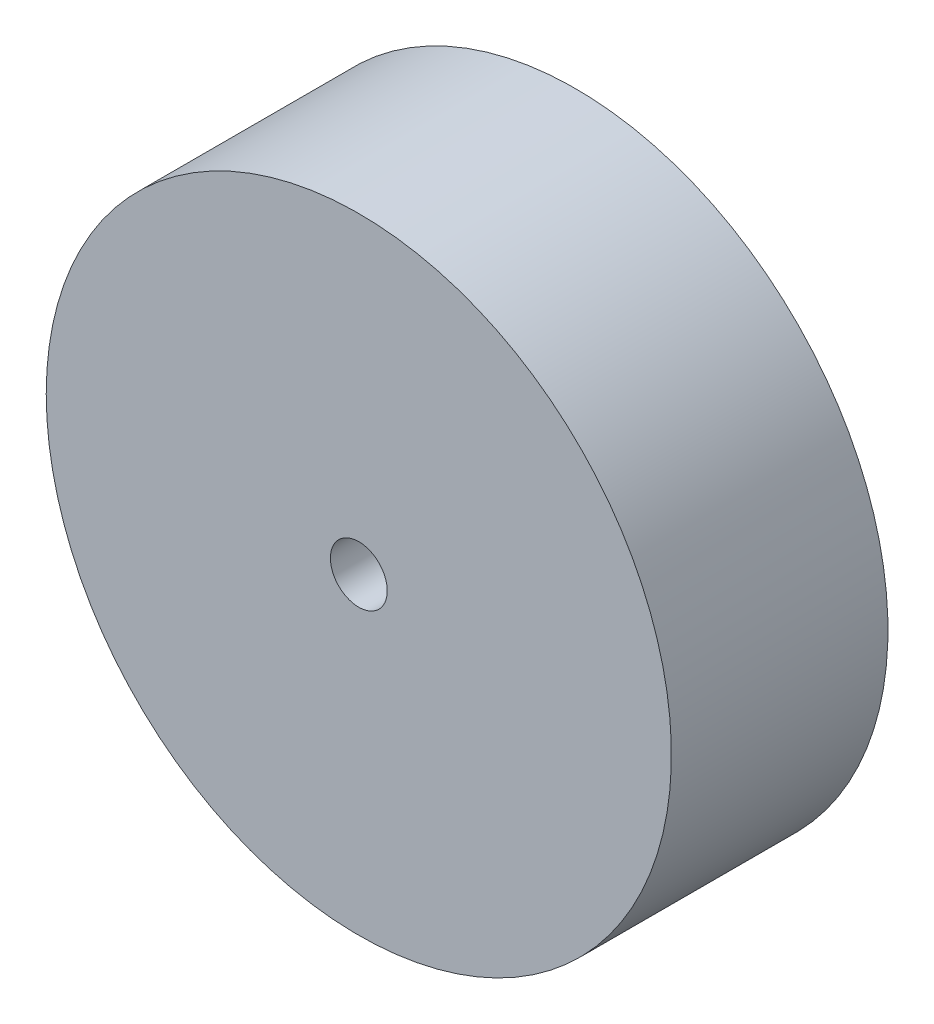
ISO-10303-21;
HEADER;
FILE_DESCRIPTION(('STEP AP214'),'2;1');
FILE_NAME('part.step','',(''),(''),'','','');
FILE_SCHEMA(('AUTOMOTIVE_DESIGN { 1 0 10303 214 1 1 1 1 }'));
ENDSEC;
DATA;
#1=APPLICATION_CONTEXT('core data for automotive mechanical design processes');
#2=APPLICATION_PROTOCOL_DEFINITION('international standard','automotive_design',2000,#1);
#3=PRODUCT_CONTEXT('',#1,'mechanical');
#4=PRODUCT('Part','Part','',(#3));
#5=PRODUCT_RELATED_PRODUCT_CATEGORY('part','',(#4));
#6=PRODUCT_DEFINITION_FORMATION('','',#4);
#7=PRODUCT_DEFINITION_CONTEXT('part definition',#1,'design');
#8=PRODUCT_DEFINITION('design','',#6,#7);
#9=PRODUCT_DEFINITION_SHAPE('','',#8);
#10=(LENGTH_UNIT() NAMED_UNIT(*) SI_UNIT(.MILLI.,.METRE.));
#11=(NAMED_UNIT(*) PLANE_ANGLE_UNIT() SI_UNIT($,.RADIAN.));
#12=(NAMED_UNIT(*) SI_UNIT($,.STERADIAN.) SOLID_ANGLE_UNIT());
#13=UNCERTAINTY_MEASURE_WITH_UNIT(LENGTH_MEASURE(1.E-05),#10,'distance_accuracy_value','');
#14=(GEOMETRIC_REPRESENTATION_CONTEXT(3) GLOBAL_UNCERTAINTY_ASSIGNED_CONTEXT((#13)) GLOBAL_UNIT_ASSIGNED_CONTEXT((#10,
#11,#12)) REPRESENTATION_CONTEXT('',''));
#15=CARTESIAN_POINT('',(0.,0.,0.));
#16=DIRECTION('',(0.,0.,1.));
#17=DIRECTION('',(1.,0.,0.));
#18=AXIS2_PLACEMENT_3D('',#15,#16,#17);
#19=CARTESIAN_POINT('',(0.,0.,114.3));
#20=DIRECTION('',(0.,0.,1.));
#21=DIRECTION('',(1.,0.,0.));
#22=AXIS2_PLACEMENT_3D('',#19,#20,#21);
#23=PLANE('',#22);
#24=CARTESIAN_POINT('',(0.,0.,114.3));
#25=DIRECTION('',(0.,0.,-1.));
#26=DIRECTION('',(-1.,0.,0.));
#27=AXIS2_PLACEMENT_3D('',#24,#25,#26);
#28=CIRCLE('',#27,15.);
#29=CARTESIAN_POINT('',(-15.,0.,114.3));
#30=VERTEX_POINT('',#29);
#31=EDGE_CURVE('E397',#30,#30,#28,.T.);
#32=ORIENTED_EDGE('',*,*,#31,.T.);
#33=EDGE_LOOP('',(#32));
#34=FACE_BOUND('',#33,.T.);
#35=CARTESIAN_POINT('',(0.,0.,114.3));
#36=DIRECTION('',(0.,0.,-1.));
#37=DIRECTION('',(-1.,0.,0.));
#38=AXIS2_PLACEMENT_3D('',#35,#36,#37);
#39=CIRCLE('',#38,165.);
#40=CARTESIAN_POINT('',(-165.,0.,114.3));
#41=VERTEX_POINT('',#40);
#42=EDGE_CURVE('E402',#41,#41,#39,.T.);
#43=ORIENTED_EDGE('',*,*,#42,.F.);
#44=EDGE_LOOP('',(#43));
#45=FACE_BOUND('',#44,.T.);
#46=ADVANCED_FACE('F386',(#34,#45),#23,.T.);
#47=CARTESIAN_POINT('',(0.,0.,0.));
#48=DIRECTION('',(0.,0.,1.));
#49=DIRECTION('',(1.,0.,0.));
#50=AXIS2_PLACEMENT_3D('',#47,#48,#49);
#51=PLANE('',#50);
#52=CARTESIAN_POINT('',(0.,0.,0.));
#53=DIRECTION('',(0.,0.,-1.));
#54=DIRECTION('',(-1.,0.,0.));
#55=AXIS2_PLACEMENT_3D('',#52,#53,#54);
#56=CIRCLE('',#55,57.);
#57=CARTESIAN_POINT('',(-57.,0.,0.));
#58=VERTEX_POINT('',#57);
#59=EDGE_CURVE('E390',#58,#58,#56,.T.);
#60=ORIENTED_EDGE('',*,*,#59,.F.);
#61=EDGE_LOOP('',(#60));
#62=FACE_BOUND('',#61,.T.);
#63=CARTESIAN_POINT('',(0.,0.,0.));
#64=DIRECTION('',(0.,0.,-1.));
#65=DIRECTION('',(-1.,0.,0.));
#66=AXIS2_PLACEMENT_3D('',#63,#64,#65);
#67=CIRCLE('',#66,165.);
#68=CARTESIAN_POINT('',(-165.,0.,0.));
#69=VERTEX_POINT('',#68);
#70=EDGE_CURVE('E407',#69,#69,#67,.T.);
#71=ORIENTED_EDGE('',*,*,#70,.T.);
#72=EDGE_LOOP('',(#71));
#73=FACE_BOUND('',#72,.T.);
#74=ADVANCED_FACE('F388',(#62,#73),#51,.F.);
#75=CARTESIAN_POINT('',(0.,0.,57.15));
#76=DIRECTION('',(0.,0.,-1.));
#77=DIRECTION('',(-1.,0.,0.));
#78=AXIS2_PLACEMENT_3D('',#75,#76,#77);
#79=CYLINDRICAL_SURFACE('',#78,57.);
#80=CARTESIAN_POINT('',(0.,0.,57.15));
#81=DIRECTION('',(0.,0.,-1.));
#82=DIRECTION('',(-1.,0.,0.));
#83=AXIS2_PLACEMENT_3D('',#80,#81,#82);
#84=CIRCLE('',#83,57.);
#85=CARTESIAN_POINT('',(-57.,0.,57.15));
#86=VERTEX_POINT('',#85);
#87=EDGE_CURVE('E13',#86,#86,#84,.T.);
#88=ORIENTED_EDGE('',*,*,#87,.F.);
#89=EDGE_LOOP('',(#88));
#90=FACE_BOUND('',#89,.T.);
#91=ORIENTED_EDGE('',*,*,#59,.T.);
#92=EDGE_LOOP('',(#91));
#93=FACE_BOUND('',#92,.T.);
#94=ADVANCED_FACE('F428',(#90,#93),#79,.F.);
#95=CARTESIAN_POINT('',(0.,0.,57.15));
#96=DIRECTION('',(0.,0.,-1.));
#97=DIRECTION('',(-1.,0.,0.));
#98=AXIS2_PLACEMENT_3D('',#95,#96,#97);
#99=PLANE('',#98);
#100=CARTESIAN_POINT('',(0.,0.,57.15));
#101=DIRECTION('',(0.,0.,-1.));
#102=DIRECTION('',(-1.,0.,0.));
#103=AXIS2_PLACEMENT_3D('',#100,#101,#102);
#104=CIRCLE('',#103,15.);
#105=CARTESIAN_POINT('',(-15.,0.,57.15));
#106=VERTEX_POINT('',#105);
#107=EDGE_CURVE('E399',#106,#106,#104,.T.);
#108=ORIENTED_EDGE('',*,*,#107,.F.);
#109=EDGE_LOOP('',(#108));
#110=FACE_BOUND('',#109,.T.);
#111=ORIENTED_EDGE('',*,*,#87,.T.);
#112=EDGE_LOOP('',(#111));
#113=FACE_BOUND('',#112,.T.);
#114=ADVANCED_FACE('F420',(#110,#113),#99,.T.);
#115=CARTESIAN_POINT('',(0.,0.,114.3));
#116=DIRECTION('',(0.,0.,-1.));
#117=DIRECTION('',(-1.,0.,0.));
#118=AXIS2_PLACEMENT_3D('',#115,#116,#117);
#119=CYLINDRICAL_SURFACE('',#118,15.);
#120=ORIENTED_EDGE('',*,*,#31,.F.);
#121=EDGE_LOOP('',(#120));
#122=FACE_BOUND('',#121,.T.);
#123=ORIENTED_EDGE('',*,*,#107,.T.);
#124=EDGE_LOOP('',(#123));
#125=FACE_BOUND('',#124,.T.);
#126=ADVANCED_FACE('F414',(#122,#125),#119,.F.);
#127=CARTESIAN_POINT('',(0.,0.,0.));
#128=DIRECTION('',(0.,0.,1.));
#129=DIRECTION('',(1.,0.,0.));
#130=AXIS2_PLACEMENT_3D('',#127,#128,#129);
#131=CYLINDRICAL_SURFACE('',#130,165.);
#132=ORIENTED_EDGE('',*,*,#42,.T.);
#133=EDGE_LOOP('',(#132));
#134=FACE_BOUND('',#133,.T.);
#135=ORIENTED_EDGE('',*,*,#70,.F.);
#136=EDGE_LOOP('',(#135));
#137=FACE_BOUND('',#136,.T.);
#138=ADVANCED_FACE('F412',(#134,#137),#131,.T.);
#139=CLOSED_SHELL('',(#46,#74,#94,#114,#126,#138));
#140=MANIFOLD_SOLID_BREP('B2',#139);
#141=ADVANCED_BREP_SHAPE_REPRESENTATION('',(#18,#140),#14);
#142=SHAPE_DEFINITION_REPRESENTATION(#9,#141);
ENDSEC;
END-ISO-10303-21;
